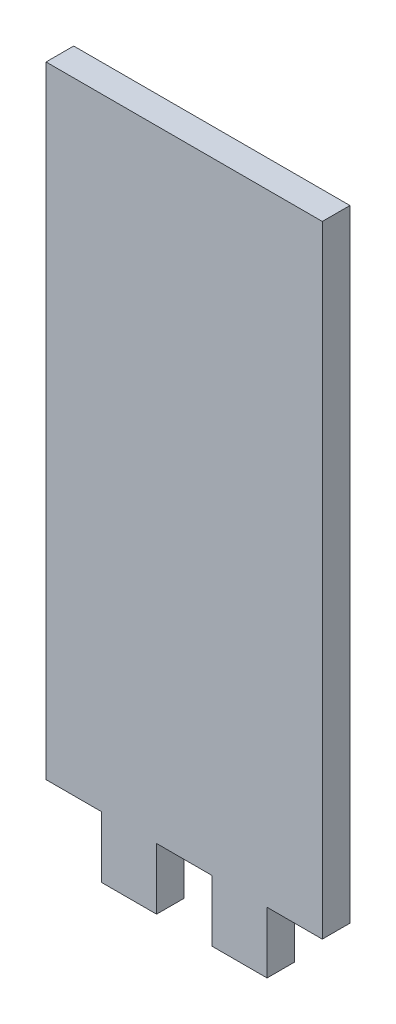
ISO-10303-21;
HEADER;
FILE_DESCRIPTION(('STEP AP214'),'2;1');
FILE_NAME('part.step','',(''),(''),'','','');
FILE_SCHEMA(('AUTOMOTIVE_DESIGN { 1 0 10303 214 1 1 1 1 }'));
ENDSEC;
DATA;
#1=APPLICATION_CONTEXT('core data for automotive mechanical design processes');
#2=APPLICATION_PROTOCOL_DEFINITION('international standard','automotive_design',2000,#1);
#3=PRODUCT_CONTEXT('',#1,'mechanical');
#4=PRODUCT('Part','Part','',(#3));
#5=PRODUCT_RELATED_PRODUCT_CATEGORY('part','',(#4));
#6=PRODUCT_DEFINITION_FORMATION('','',#4);
#7=PRODUCT_DEFINITION_CONTEXT('part definition',#1,'design');
#8=PRODUCT_DEFINITION('design','',#6,#7);
#9=PRODUCT_DEFINITION_SHAPE('','',#8);
#10=(LENGTH_UNIT() NAMED_UNIT(*) SI_UNIT(.MILLI.,.METRE.));
#11=(NAMED_UNIT(*) PLANE_ANGLE_UNIT() SI_UNIT($,.RADIAN.));
#12=(NAMED_UNIT(*) SI_UNIT($,.STERADIAN.) SOLID_ANGLE_UNIT());
#13=UNCERTAINTY_MEASURE_WITH_UNIT(LENGTH_MEASURE(1.E-05),#10,'distance_accuracy_value','');
#14=(GEOMETRIC_REPRESENTATION_CONTEXT(3) GLOBAL_UNCERTAINTY_ASSIGNED_CONTEXT((#13)) GLOBAL_UNIT_ASSIGNED_CONTEXT((#10,
#11,#12)) REPRESENTATION_CONTEXT('',''));
#15=CARTESIAN_POINT('',(0.,0.,0.));
#16=DIRECTION('',(0.,0.,1.));
#17=DIRECTION('',(1.,0.,0.));
#18=AXIS2_PLACEMENT_3D('',#15,#16,#17);
#19=CARTESIAN_POINT('',(-10.,-22.5,2.));
#20=DIRECTION('',(1.,0.,0.));
#21=DIRECTION('',(0.,0.,-1.));
#22=AXIS2_PLACEMENT_3D('',#19,#20,#21);
#23=PLANE('',#22);
#24=DIRECTION('',(0.,-1.,0.));
#25=VECTOR('',#24,1.);
#26=CARTESIAN_POINT('',(-10.,-22.5,0.));
#27=LINE('',#26,#25);
#28=CARTESIAN_POINT('',(-10.,22.5,0.));
#29=VERTEX_POINT('',#28);
#30=CARTESIAN_POINT('',(-10.,-22.5,0.));
#31=VERTEX_POINT('',#30);
#32=EDGE_CURVE('E161',#29,#31,#27,.T.);
#33=ORIENTED_EDGE('',*,*,#32,.T.);
#34=DIRECTION('',(0.,0.,-1.));
#35=VECTOR('',#34,1.);
#36=CARTESIAN_POINT('',(-10.,-22.5,2.));
#37=LINE('',#36,#35);
#38=CARTESIAN_POINT('',(-10.,-22.5,2.));
#39=VERTEX_POINT('',#38);
#40=EDGE_CURVE('E11',#39,#31,#37,.T.);
#41=ORIENTED_EDGE('',*,*,#40,.F.);
#42=DIRECTION('',(0.,-1.,0.));
#43=VECTOR('',#42,1.);
#44=CARTESIAN_POINT('',(-10.,-22.5,2.));
#45=LINE('',#44,#43);
#46=CARTESIAN_POINT('',(-10.,22.5,2.));
#47=VERTEX_POINT('',#46);
#48=EDGE_CURVE('E183',#47,#39,#45,.T.);
#49=ORIENTED_EDGE('',*,*,#48,.F.);
#50=DIRECTION('',(0.,0.,-1.));
#51=VECTOR('',#50,1.);
#52=CARTESIAN_POINT('',(-10.,22.5,2.));
#53=LINE('',#52,#51);
#54=EDGE_CURVE('E157',#47,#29,#53,.T.);
#55=ORIENTED_EDGE('',*,*,#54,.T.);
#56=EDGE_LOOP('',(#33,#41,#49,#55));
#57=FACE_BOUND('',#56,.T.);
#58=ADVANCED_FACE('F41',(#57),#23,.F.);
#59=CARTESIAN_POINT('',(-6.,-22.5,2.));
#60=DIRECTION('',(0.,1.,0.));
#61=DIRECTION('',(-1.,0.,0.));
#62=AXIS2_PLACEMENT_3D('',#59,#60,#61);
#63=PLANE('',#62);
#64=DIRECTION('',(1.,0.,0.));
#65=VECTOR('',#64,1.);
#66=CARTESIAN_POINT('',(-6.,-22.5,0.));
#67=LINE('',#66,#65);
#68=CARTESIAN_POINT('',(-6.,-22.5,0.));
#69=VERTEX_POINT('',#68);
#70=EDGE_CURVE('E164',#31,#69,#67,.T.);
#71=ORIENTED_EDGE('',*,*,#70,.T.);
#72=DIRECTION('',(0.,0.,-1.));
#73=VECTOR('',#72,1.);
#74=CARTESIAN_POINT('',(-6.,-22.5,2.));
#75=LINE('',#74,#73);
#76=CARTESIAN_POINT('',(-6.,-22.5,2.));
#77=VERTEX_POINT('',#76);
#78=EDGE_CURVE('E49',#77,#69,#75,.T.);
#79=ORIENTED_EDGE('',*,*,#78,.F.);
#80=DIRECTION('',(1.,0.,0.));
#81=VECTOR('',#80,1.);
#82=CARTESIAN_POINT('',(-6.,-22.5,2.));
#83=LINE('',#82,#81);
#84=EDGE_CURVE('E112',#39,#77,#83,.T.);
#85=ORIENTED_EDGE('',*,*,#84,.F.);
#86=ORIENTED_EDGE('',*,*,#40,.T.);
#87=EDGE_LOOP('',(#71,#79,#85,#86));
#88=FACE_BOUND('',#87,.T.);
#89=ADVANCED_FACE('F261',(#88),#63,.F.);
#90=CARTESIAN_POINT('',(-6.,-22.5,2.));
#91=DIRECTION('',(1.,0.,0.));
#92=DIRECTION('',(0.,0.,-1.));
#93=AXIS2_PLACEMENT_3D('',#90,#91,#92);
#94=PLANE('',#93);
#95=DIRECTION('',(0.,-1.,0.));
#96=VECTOR('',#95,1.);
#97=CARTESIAN_POINT('',(-6.,-22.5,0.));
#98=LINE('',#97,#96);
#99=CARTESIAN_POINT('',(-6.,-26.9351524944721,0.));
#100=VERTEX_POINT('',#99);
#101=EDGE_CURVE('E166',#69,#100,#98,.T.);
#102=ORIENTED_EDGE('',*,*,#101,.T.);
#103=DIRECTION('',(0.,0.,-1.));
#104=VECTOR('',#103,1.);
#105=CARTESIAN_POINT('',(-6.,-26.9351524944721,2.));
#106=LINE('',#105,#104);
#107=CARTESIAN_POINT('',(-6.,-26.9351524944721,2.));
#108=VERTEX_POINT('',#107);
#109=EDGE_CURVE('E202',#108,#100,#106,.T.);
#110=ORIENTED_EDGE('',*,*,#109,.F.);
#111=DIRECTION('',(0.,-1.,0.));
#112=VECTOR('',#111,1.);
#113=CARTESIAN_POINT('',(-6.,-22.5,2.));
#114=LINE('',#113,#112);
#115=EDGE_CURVE('E210',#77,#108,#114,.T.);
#116=ORIENTED_EDGE('',*,*,#115,.F.);
#117=ORIENTED_EDGE('',*,*,#78,.T.);
#118=EDGE_LOOP('',(#102,#110,#116,#117));
#119=FACE_BOUND('',#118,.T.);
#120=ADVANCED_FACE('F208',(#119),#94,.F.);
#121=CARTESIAN_POINT('',(-6.,-26.9351524944721,2.));
#122=DIRECTION('',(0.,1.,0.));
#123=DIRECTION('',(0.,0.,1.));
#124=AXIS2_PLACEMENT_3D('',#121,#122,#123);
#125=PLANE('',#124);
#126=DIRECTION('',(1.,0.,0.));
#127=VECTOR('',#126,1.);
#128=CARTESIAN_POINT('',(-6.,-26.9351524944721,0.));
#129=LINE('',#128,#127);
#130=CARTESIAN_POINT('',(-2.,-26.9351524944721,0.));
#131=VERTEX_POINT('',#130);
#132=EDGE_CURVE('E168',#100,#131,#129,.T.);
#133=ORIENTED_EDGE('',*,*,#132,.T.);
#134=DIRECTION('',(0.,0.,-1.));
#135=VECTOR('',#134,1.);
#136=CARTESIAN_POINT('',(-2.,-26.9351524944721,2.));
#137=LINE('',#136,#135);
#138=CARTESIAN_POINT('',(-2.,-26.9351524944721,2.));
#139=VERTEX_POINT('',#138);
#140=EDGE_CURVE('E199',#139,#131,#137,.T.);
#141=ORIENTED_EDGE('',*,*,#140,.F.);
#142=DIRECTION('',(1.,0.,0.));
#143=VECTOR('',#142,1.);
#144=CARTESIAN_POINT('',(-6.,-26.9351524944721,2.));
#145=LINE('',#144,#143);
#146=EDGE_CURVE('E228',#108,#139,#145,.T.);
#147=ORIENTED_EDGE('',*,*,#146,.F.);
#148=ORIENTED_EDGE('',*,*,#109,.T.);
#149=EDGE_LOOP('',(#133,#141,#147,#148));
#150=FACE_BOUND('',#149,.T.);
#151=ADVANCED_FACE('F219',(#150),#125,.F.);
#152=CARTESIAN_POINT('',(-2.,-26.9351524944721,2.));
#153=DIRECTION('',(-1.,0.,0.));
#154=DIRECTION('',(0.,0.,1.));
#155=AXIS2_PLACEMENT_3D('',#152,#153,#154);
#156=PLANE('',#155);
#157=DIRECTION('',(0.,1.,0.));
#158=VECTOR('',#157,1.);
#159=CARTESIAN_POINT('',(-2.,-26.9351524944721,0.));
#160=LINE('',#159,#158);
#161=CARTESIAN_POINT('',(-2.,-22.5,0.));
#162=VERTEX_POINT('',#161);
#163=EDGE_CURVE('E170',#131,#162,#160,.T.);
#164=ORIENTED_EDGE('',*,*,#163,.T.);
#165=DIRECTION('',(0.,0.,-1.));
#166=VECTOR('',#165,1.);
#167=CARTESIAN_POINT('',(-2.,-22.5,2.));
#168=LINE('',#167,#166);
#169=CARTESIAN_POINT('',(-2.,-22.5,2.));
#170=VERTEX_POINT('',#169);
#171=EDGE_CURVE('E196',#170,#162,#168,.T.);
#172=ORIENTED_EDGE('',*,*,#171,.F.);
#173=DIRECTION('',(0.,1.,0.));
#174=VECTOR('',#173,1.);
#175=CARTESIAN_POINT('',(-2.,-26.9351524944721,2.));
#176=LINE('',#175,#174);
#177=EDGE_CURVE('E225',#139,#170,#176,.T.);
#178=ORIENTED_EDGE('',*,*,#177,.F.);
#179=ORIENTED_EDGE('',*,*,#140,.T.);
#180=EDGE_LOOP('',(#164,#172,#178,#179));
#181=FACE_BOUND('',#180,.T.);
#182=ADVANCED_FACE('F223',(#181),#156,.F.);
#183=CARTESIAN_POINT('',(-2.,-22.5,2.));
#184=DIRECTION('',(0.,1.,0.));
#185=DIRECTION('',(0.,0.,1.));
#186=AXIS2_PLACEMENT_3D('',#183,#184,#185);
#187=PLANE('',#186);
#188=DIRECTION('',(1.,0.,0.));
#189=VECTOR('',#188,1.);
#190=CARTESIAN_POINT('',(-2.,-22.5,0.));
#191=LINE('',#190,#189);
#192=CARTESIAN_POINT('',(2.,-22.5,0.));
#193=VERTEX_POINT('',#192);
#194=EDGE_CURVE('E172',#162,#193,#191,.T.);
#195=ORIENTED_EDGE('',*,*,#194,.T.);
#196=DIRECTION('',(0.,0.,-1.));
#197=VECTOR('',#196,1.);
#198=CARTESIAN_POINT('',(2.,-22.5,2.));
#199=LINE('',#198,#197);
#200=CARTESIAN_POINT('',(2.,-22.5,2.));
#201=VERTEX_POINT('',#200);
#202=EDGE_CURVE('E193',#201,#193,#199,.T.);
#203=ORIENTED_EDGE('',*,*,#202,.F.);
#204=DIRECTION('',(1.,0.,0.));
#205=VECTOR('',#204,1.);
#206=CARTESIAN_POINT('',(-2.,-22.5,2.));
#207=LINE('',#206,#205);
#208=EDGE_CURVE('E227',#170,#201,#207,.T.);
#209=ORIENTED_EDGE('',*,*,#208,.F.);
#210=ORIENTED_EDGE('',*,*,#171,.T.);
#211=EDGE_LOOP('',(#195,#203,#209,#210));
#212=FACE_BOUND('',#211,.T.);
#213=ADVANCED_FACE('F274',(#212),#187,.F.);
#214=CARTESIAN_POINT('',(2.,-22.5,2.));
#215=DIRECTION('',(1.,0.,0.));
#216=DIRECTION('',(0.,1.,0.));
#217=AXIS2_PLACEMENT_3D('',#214,#215,#216);
#218=PLANE('',#217);
#219=DIRECTION('',(0.,-1.,0.));
#220=VECTOR('',#219,1.);
#221=CARTESIAN_POINT('',(2.,-22.5,0.));
#222=LINE('',#221,#220);
#223=CARTESIAN_POINT('',(2.,-26.9351524944721,0.));
#224=VERTEX_POINT('',#223);
#225=EDGE_CURVE('E174',#193,#224,#222,.T.);
#226=ORIENTED_EDGE('',*,*,#225,.T.);
#227=DIRECTION('',(0.,0.,-1.));
#228=VECTOR('',#227,1.);
#229=CARTESIAN_POINT('',(2.,-26.9351524944721,2.));
#230=LINE('',#229,#228);
#231=CARTESIAN_POINT('',(2.,-26.9351524944721,2.));
#232=VERTEX_POINT('',#231);
#233=EDGE_CURVE('E190',#232,#224,#230,.T.);
#234=ORIENTED_EDGE('',*,*,#233,.F.);
#235=DIRECTION('',(0.,-1.,0.));
#236=VECTOR('',#235,1.);
#237=CARTESIAN_POINT('',(2.,-22.5,2.));
#238=LINE('',#237,#236);
#239=EDGE_CURVE('E230',#201,#232,#238,.T.);
#240=ORIENTED_EDGE('',*,*,#239,.F.);
#241=ORIENTED_EDGE('',*,*,#202,.T.);
#242=EDGE_LOOP('',(#226,#234,#240,#241));
#243=FACE_BOUND('',#242,.T.);
#244=ADVANCED_FACE('F277',(#243),#218,.F.);
#245=CARTESIAN_POINT('',(2.,-26.9351524944721,2.));
#246=DIRECTION('',(0.,1.,0.));
#247=DIRECTION('',(0.,0.,1.));
#248=AXIS2_PLACEMENT_3D('',#245,#246,#247);
#249=PLANE('',#248);
#250=DIRECTION('',(1.,0.,0.));
#251=VECTOR('',#250,1.);
#252=CARTESIAN_POINT('',(2.,-26.9351524944721,0.));
#253=LINE('',#252,#251);
#254=CARTESIAN_POINT('',(6.,-26.9351524944721,0.));
#255=VERTEX_POINT('',#254);
#256=EDGE_CURVE('E176',#224,#255,#253,.T.);
#257=ORIENTED_EDGE('',*,*,#256,.T.);
#258=DIRECTION('',(0.,0.,-1.));
#259=VECTOR('',#258,1.);
#260=CARTESIAN_POINT('',(6.,-26.9351524944721,2.));
#261=LINE('',#260,#259);
#262=CARTESIAN_POINT('',(6.,-26.9351524944721,2.));
#263=VERTEX_POINT('',#262);
#264=EDGE_CURVE('E187',#263,#255,#261,.T.);
#265=ORIENTED_EDGE('',*,*,#264,.F.);
#266=DIRECTION('',(1.,0.,0.));
#267=VECTOR('',#266,1.);
#268=CARTESIAN_POINT('',(2.,-26.9351524944721,2.));
#269=LINE('',#268,#267);
#270=EDGE_CURVE('E236',#232,#263,#269,.T.);
#271=ORIENTED_EDGE('',*,*,#270,.F.);
#272=ORIENTED_EDGE('',*,*,#233,.T.);
#273=EDGE_LOOP('',(#257,#265,#271,#272));
#274=FACE_BOUND('',#273,.T.);
#275=ADVANCED_FACE('F242',(#274),#249,.F.);
#276=CARTESIAN_POINT('',(6.,-26.9351524944721,2.));
#277=DIRECTION('',(-1.,0.,0.));
#278=DIRECTION('',(0.,0.,1.));
#279=AXIS2_PLACEMENT_3D('',#276,#277,#278);
#280=PLANE('',#279);
#281=DIRECTION('',(0.,1.,0.));
#282=VECTOR('',#281,1.);
#283=CARTESIAN_POINT('',(6.,-26.9351524944721,0.));
#284=LINE('',#283,#282);
#285=CARTESIAN_POINT('',(6.,-22.5,0.));
#286=VERTEX_POINT('',#285);
#287=EDGE_CURVE('E178',#255,#286,#284,.T.);
#288=ORIENTED_EDGE('',*,*,#287,.T.);
#289=DIRECTION('',(0.,0.,-1.));
#290=VECTOR('',#289,1.);
#291=CARTESIAN_POINT('',(6.,-22.5,2.));
#292=LINE('',#291,#290);
#293=CARTESIAN_POINT('',(6.,-22.5,2.));
#294=VERTEX_POINT('',#293);
#295=EDGE_CURVE('E152',#294,#286,#292,.T.);
#296=ORIENTED_EDGE('',*,*,#295,.F.);
#297=DIRECTION('',(0.,1.,0.));
#298=VECTOR('',#297,1.);
#299=CARTESIAN_POINT('',(6.,-26.9351524944721,2.));
#300=LINE('',#299,#298);
#301=EDGE_CURVE('E143',#263,#294,#300,.T.);
#302=ORIENTED_EDGE('',*,*,#301,.F.);
#303=ORIENTED_EDGE('',*,*,#264,.T.);
#304=EDGE_LOOP('',(#288,#296,#302,#303));
#305=FACE_BOUND('',#304,.T.);
#306=ADVANCED_FACE('F246',(#305),#280,.F.);
#307=CARTESIAN_POINT('',(10.,-22.5,2.));
#308=DIRECTION('',(0.,1.,0.));
#309=DIRECTION('',(-1.,0.,0.));
#310=AXIS2_PLACEMENT_3D('',#307,#308,#309);
#311=PLANE('',#310);
#312=DIRECTION('',(1.,0.,0.));
#313=VECTOR('',#312,1.);
#314=CARTESIAN_POINT('',(10.,-22.5,0.));
#315=LINE('',#314,#313);
#316=CARTESIAN_POINT('',(10.,-22.5,0.));
#317=VERTEX_POINT('',#316);
#318=EDGE_CURVE('E151',#286,#317,#315,.T.);
#319=ORIENTED_EDGE('',*,*,#318,.T.);
#320=DIRECTION('',(0.,0.,-1.));
#321=VECTOR('',#320,1.);
#322=CARTESIAN_POINT('',(10.,-22.5,2.));
#323=LINE('',#322,#321);
#324=CARTESIAN_POINT('',(10.,-22.5,2.));
#325=VERTEX_POINT('',#324);
#326=EDGE_CURVE('E148',#325,#317,#323,.T.);
#327=ORIENTED_EDGE('',*,*,#326,.F.);
#328=DIRECTION('',(1.,0.,0.));
#329=VECTOR('',#328,1.);
#330=CARTESIAN_POINT('',(10.,-22.5,2.));
#331=LINE('',#330,#329);
#332=EDGE_CURVE('E137',#294,#325,#331,.T.);
#333=ORIENTED_EDGE('',*,*,#332,.F.);
#334=ORIENTED_EDGE('',*,*,#295,.T.);
#335=EDGE_LOOP('',(#319,#327,#333,#334));
#336=FACE_BOUND('',#335,.T.);
#337=ADVANCED_FACE('F149',(#336),#311,.F.);
#338=CARTESIAN_POINT('',(10.,-22.5,2.));
#339=DIRECTION('',(-1.,0.,0.));
#340=DIRECTION('',(0.,0.,1.));
#341=AXIS2_PLACEMENT_3D('',#338,#339,#340);
#342=PLANE('',#341);
#343=DIRECTION('',(0.,1.,0.));
#344=VECTOR('',#343,1.);
#345=CARTESIAN_POINT('',(10.,-22.5,0.));
#346=LINE('',#345,#344);
#347=CARTESIAN_POINT('',(10.,22.5,0.));
#348=VERTEX_POINT('',#347);
#349=EDGE_CURVE('E98',#317,#348,#346,.T.);
#350=ORIENTED_EDGE('',*,*,#349,.T.);
#351=DIRECTION('',(0.,0.,-1.));
#352=VECTOR('',#351,1.);
#353=CARTESIAN_POINT('',(10.,22.5,2.));
#354=LINE('',#353,#352);
#355=CARTESIAN_POINT('',(10.,22.5,2.));
#356=VERTEX_POINT('',#355);
#357=EDGE_CURVE('E153',#356,#348,#354,.T.);
#358=ORIENTED_EDGE('',*,*,#357,.F.);
#359=DIRECTION('',(0.,1.,0.));
#360=VECTOR('',#359,1.);
#361=CARTESIAN_POINT('',(10.,-22.5,2.));
#362=LINE('',#361,#360);
#363=EDGE_CURVE('E141',#325,#356,#362,.T.);
#364=ORIENTED_EDGE('',*,*,#363,.F.);
#365=ORIENTED_EDGE('',*,*,#326,.T.);
#366=EDGE_LOOP('',(#350,#358,#364,#365));
#367=FACE_BOUND('',#366,.T.);
#368=ADVANCED_FACE('F155',(#367),#342,.F.);
#369=CARTESIAN_POINT('',(10.,22.5,2.));
#370=DIRECTION('',(0.,-1.,0.));
#371=DIRECTION('',(0.,0.,-1.));
#372=AXIS2_PLACEMENT_3D('',#369,#370,#371);
#373=PLANE('',#372);
#374=DIRECTION('',(-1.,0.,0.));
#375=VECTOR('',#374,1.);
#376=CARTESIAN_POINT('',(10.,22.5,0.));
#377=LINE('',#376,#375);
#378=EDGE_CURVE('E104',#348,#29,#377,.T.);
#379=ORIENTED_EDGE('',*,*,#378,.T.);
#380=ORIENTED_EDGE('',*,*,#54,.F.);
#381=DIRECTION('',(-1.,0.,0.));
#382=VECTOR('',#381,1.);
#383=CARTESIAN_POINT('',(10.,22.5,2.));
#384=LINE('',#383,#382);
#385=EDGE_CURVE('E57',#356,#47,#384,.T.);
#386=ORIENTED_EDGE('',*,*,#385,.F.);
#387=ORIENTED_EDGE('',*,*,#357,.T.);
#388=EDGE_LOOP('',(#379,#380,#386,#387));
#389=FACE_BOUND('',#388,.T.);
#390=ADVANCED_FACE('F250',(#389),#373,.F.);
#391=CARTESIAN_POINT('',(0.,0.,2.));
#392=DIRECTION('',(0.,0.,1.));
#393=DIRECTION('',(1.,0.,0.));
#394=AXIS2_PLACEMENT_3D('',#391,#392,#393);
#395=PLANE('',#394);
#396=ORIENTED_EDGE('',*,*,#48,.T.);
#397=ORIENTED_EDGE('',*,*,#84,.T.);
#398=ORIENTED_EDGE('',*,*,#115,.T.);
#399=ORIENTED_EDGE('',*,*,#146,.T.);
#400=ORIENTED_EDGE('',*,*,#177,.T.);
#401=ORIENTED_EDGE('',*,*,#208,.T.);
#402=ORIENTED_EDGE('',*,*,#239,.T.);
#403=ORIENTED_EDGE('',*,*,#270,.T.);
#404=ORIENTED_EDGE('',*,*,#301,.T.);
#405=ORIENTED_EDGE('',*,*,#332,.T.);
#406=ORIENTED_EDGE('',*,*,#363,.T.);
#407=ORIENTED_EDGE('',*,*,#385,.T.);
#408=EDGE_LOOP('',(#396,#397,#398,#399,#400,#401,#402,#403,#404,#405,#406,#407));
#409=FACE_BOUND('',#408,.T.);
#410=ADVANCED_FACE('F139',(#409),#395,.T.);
#411=CARTESIAN_POINT('',(0.,0.,0.));
#412=DIRECTION('',(0.,0.,1.));
#413=DIRECTION('',(1.,0.,0.));
#414=AXIS2_PLACEMENT_3D('',#411,#412,#413);
#415=PLANE('',#414);
#416=ORIENTED_EDGE('',*,*,#32,.F.);
#417=ORIENTED_EDGE('',*,*,#378,.F.);
#418=ORIENTED_EDGE('',*,*,#349,.F.);
#419=ORIENTED_EDGE('',*,*,#318,.F.);
#420=ORIENTED_EDGE('',*,*,#287,.F.);
#421=ORIENTED_EDGE('',*,*,#256,.F.);
#422=ORIENTED_EDGE('',*,*,#225,.F.);
#423=ORIENTED_EDGE('',*,*,#194,.F.);
#424=ORIENTED_EDGE('',*,*,#163,.F.);
#425=ORIENTED_EDGE('',*,*,#132,.F.);
#426=ORIENTED_EDGE('',*,*,#101,.F.);
#427=ORIENTED_EDGE('',*,*,#70,.F.);
#428=EDGE_LOOP('',(#416,#417,#418,#419,#420,#421,#422,#423,#424,#425,#426,#427));
#429=FACE_BOUND('',#428,.T.);
#430=ADVANCED_FACE('F214',(#429),#415,.F.);
#431=CLOSED_SHELL('',(#58,#89,#120,#151,#182,#213,#244,#275,#306,#337,#368,#390,#410,#430));
#432=MANIFOLD_SOLID_BREP('B2',#431);
#433=ADVANCED_BREP_SHAPE_REPRESENTATION('',(#18,#432),#14);
#434=SHAPE_DEFINITION_REPRESENTATION(#9,#433);
ENDSEC;
END-ISO-10303-21;
